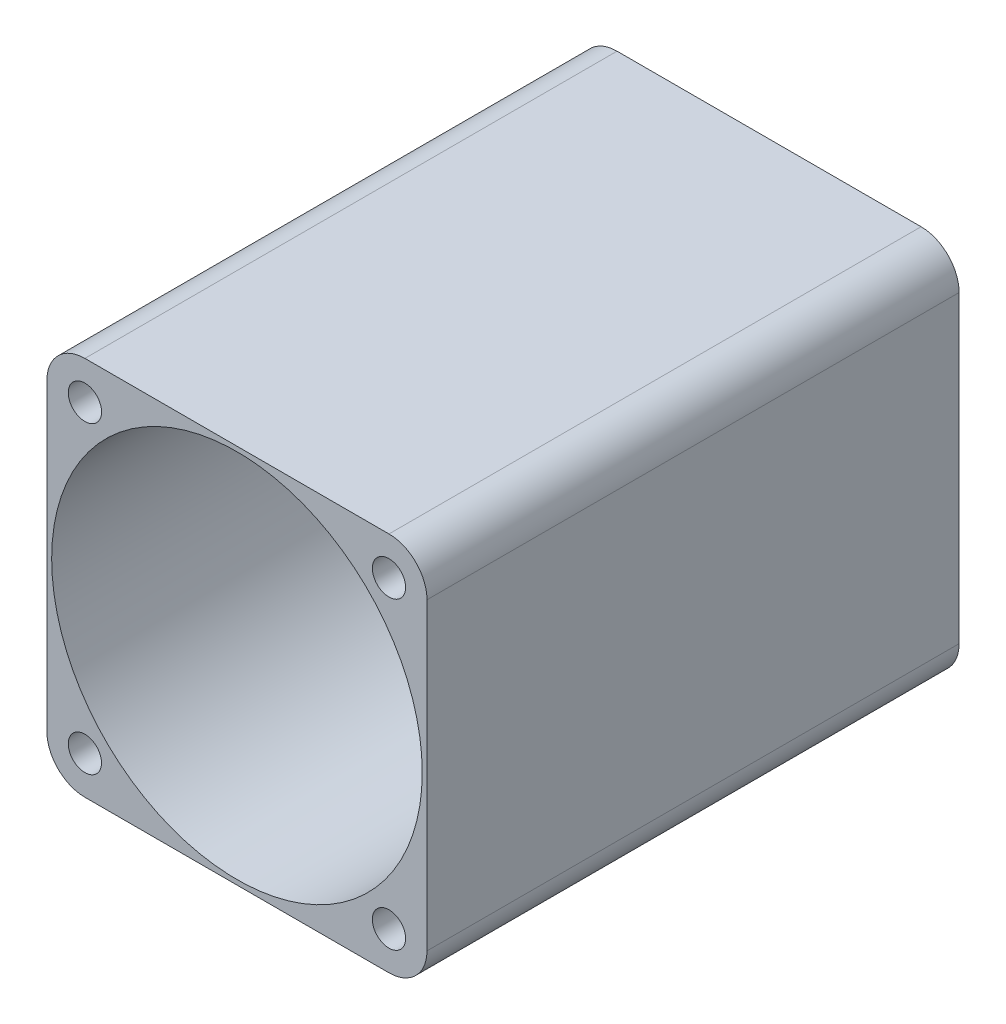
ISO-10303-21;
HEADER;
FILE_DESCRIPTION(('STEP AP214'),'2;1');
FILE_NAME('part.step','',(''),(''),'','','');
FILE_SCHEMA(('AUTOMOTIVE_DESIGN { 1 0 10303 214 1 1 1 1 }'));
ENDSEC;
DATA;
#1=APPLICATION_CONTEXT('core data for automotive mechanical design processes');
#2=APPLICATION_PROTOCOL_DEFINITION('international standard','automotive_design',2000,#1);
#3=PRODUCT_CONTEXT('',#1,'mechanical');
#4=PRODUCT('Part','Part','',(#3));
#5=PRODUCT_RELATED_PRODUCT_CATEGORY('part','',(#4));
#6=PRODUCT_DEFINITION_FORMATION('','',#4);
#7=PRODUCT_DEFINITION_CONTEXT('part definition',#1,'design');
#8=PRODUCT_DEFINITION('design','',#6,#7);
#9=PRODUCT_DEFINITION_SHAPE('','',#8);
#10=(LENGTH_UNIT() NAMED_UNIT(*) SI_UNIT(.MILLI.,.METRE.));
#11=(NAMED_UNIT(*) PLANE_ANGLE_UNIT() SI_UNIT($,.RADIAN.));
#12=(NAMED_UNIT(*) SI_UNIT($,.STERADIAN.) SOLID_ANGLE_UNIT());
#13=UNCERTAINTY_MEASURE_WITH_UNIT(LENGTH_MEASURE(1.E-05),#10,'distance_accuracy_value','');
#14=(GEOMETRIC_REPRESENTATION_CONTEXT(3) GLOBAL_UNCERTAINTY_ASSIGNED_CONTEXT((#13)) GLOBAL_UNIT_ASSIGNED_CONTEXT((#10,
#11,#12)) REPRESENTATION_CONTEXT('',''));
#15=CARTESIAN_POINT('',(0.,0.,0.));
#16=DIRECTION('',(0.,0.,1.));
#17=DIRECTION('',(1.,0.,0.));
#18=AXIS2_PLACEMENT_3D('',#15,#16,#17);
#19=CARTESIAN_POINT('',(-16.,-16.,-56.));
#20=DIRECTION('',(0.,0.,1.));
#21=DIRECTION('',(1.,0.,0.));
#22=AXIS2_PLACEMENT_3D('',#19,#20,#21);
#23=CYLINDRICAL_SURFACE('',#22,4.);
#24=CARTESIAN_POINT('',(-16.,-16.,0.));
#25=DIRECTION('',(0.,0.,1.));
#26=DIRECTION('',(-1.,0.,0.));
#27=AXIS2_PLACEMENT_3D('',#24,#25,#26);
#28=CIRCLE('',#27,4.);
#29=CARTESIAN_POINT('',(-20.,-16.,0.));
#30=VERTEX_POINT('',#29);
#31=CARTESIAN_POINT('',(-16.,-20.,0.));
#32=VERTEX_POINT('',#31);
#33=EDGE_CURVE('E138',#30,#32,#28,.T.);
#34=ORIENTED_EDGE('',*,*,#33,.F.);
#35=DIRECTION('',(0.,0.,1.));
#36=VECTOR('',#35,1.);
#37=CARTESIAN_POINT('',(-20.,-16.,-56.));
#38=LINE('',#37,#36);
#39=CARTESIAN_POINT('',(-20.,-16.,-56.));
#40=VERTEX_POINT('',#39);
#41=EDGE_CURVE('E11',#40,#30,#38,.T.);
#42=ORIENTED_EDGE('',*,*,#41,.F.);
#43=CARTESIAN_POINT('',(-16.,-16.,-56.));
#44=DIRECTION('',(0.,0.,1.));
#45=DIRECTION('',(-1.,0.,0.));
#46=AXIS2_PLACEMENT_3D('',#43,#44,#45);
#47=CIRCLE('',#46,4.);
#48=CARTESIAN_POINT('',(-16.,-20.,-56.));
#49=VERTEX_POINT('',#48);
#50=EDGE_CURVE('E159',#40,#49,#47,.T.);
#51=ORIENTED_EDGE('',*,*,#50,.T.);
#52=DIRECTION('',(0.,0.,1.));
#53=VECTOR('',#52,1.);
#54=CARTESIAN_POINT('',(-16.,-20.,-56.));
#55=LINE('',#54,#53);
#56=EDGE_CURVE('E44',#49,#32,#55,.T.);
#57=ORIENTED_EDGE('',*,*,#56,.T.);
#58=EDGE_LOOP('',(#34,#42,#51,#57));
#59=FACE_BOUND('',#58,.T.);
#60=ADVANCED_FACE('F41',(#59),#23,.T.);
#61=CARTESIAN_POINT('',(-20.,-16.,-56.));
#62=DIRECTION('',(-1.,0.,0.));
#63=DIRECTION('',(0.,0.,1.));
#64=AXIS2_PLACEMENT_3D('',#61,#62,#63);
#65=PLANE('',#64);
#66=DIRECTION('',(0.,-1.,0.));
#67=VECTOR('',#66,1.);
#68=CARTESIAN_POINT('',(-20.,-16.,0.));
#69=LINE('',#68,#67);
#70=CARTESIAN_POINT('',(-20.,16.,0.));
#71=VERTEX_POINT('',#70);
#72=EDGE_CURVE('E157',#71,#30,#69,.T.);
#73=ORIENTED_EDGE('',*,*,#72,.F.);
#74=DIRECTION('',(0.,0.,1.));
#75=VECTOR('',#74,1.);
#76=CARTESIAN_POINT('',(-20.,16.,-56.));
#77=LINE('',#76,#75);
#78=CARTESIAN_POINT('',(-20.,16.,-56.));
#79=VERTEX_POINT('',#78);
#80=EDGE_CURVE('E50',#79,#71,#77,.T.);
#81=ORIENTED_EDGE('',*,*,#80,.F.);
#82=DIRECTION('',(0.,-1.,0.));
#83=VECTOR('',#82,1.);
#84=CARTESIAN_POINT('',(-20.,-16.,-56.));
#85=LINE('',#84,#83);
#86=EDGE_CURVE('E128',#79,#40,#85,.T.);
#87=ORIENTED_EDGE('',*,*,#86,.T.);
#88=ORIENTED_EDGE('',*,*,#41,.T.);
#89=EDGE_LOOP('',(#73,#81,#87,#88));
#90=FACE_BOUND('',#89,.T.);
#91=ADVANCED_FACE('F171',(#90),#65,.T.);
#92=CARTESIAN_POINT('',(-16.,16.,-56.));
#93=DIRECTION('',(0.,0.,1.));
#94=DIRECTION('',(1.,0.,0.));
#95=AXIS2_PLACEMENT_3D('',#92,#93,#94);
#96=CYLINDRICAL_SURFACE('',#95,4.);
#97=CARTESIAN_POINT('',(-16.,16.,0.));
#98=DIRECTION('',(0.,0.,1.));
#99=DIRECTION('',(1.,0.,0.));
#100=AXIS2_PLACEMENT_3D('',#97,#98,#99);
#101=CIRCLE('',#100,4.);
#102=CARTESIAN_POINT('',(-16.,20.,0.));
#103=VERTEX_POINT('',#102);
#104=EDGE_CURVE('E115',#103,#71,#101,.T.);
#105=ORIENTED_EDGE('',*,*,#104,.F.);
#106=DIRECTION('',(0.,0.,1.));
#107=VECTOR('',#106,1.);
#108=CARTESIAN_POINT('',(-16.,20.,-56.));
#109=LINE('',#108,#107);
#110=CARTESIAN_POINT('',(-16.,20.,-56.));
#111=VERTEX_POINT('',#110);
#112=EDGE_CURVE('E110',#111,#103,#109,.T.);
#113=ORIENTED_EDGE('',*,*,#112,.F.);
#114=CARTESIAN_POINT('',(-16.,16.,-56.));
#115=DIRECTION('',(0.,0.,1.));
#116=DIRECTION('',(1.,0.,0.));
#117=AXIS2_PLACEMENT_3D('',#114,#115,#116);
#118=CIRCLE('',#117,4.);
#119=EDGE_CURVE('E113',#111,#79,#118,.T.);
#120=ORIENTED_EDGE('',*,*,#119,.T.);
#121=ORIENTED_EDGE('',*,*,#80,.T.);
#122=EDGE_LOOP('',(#105,#113,#120,#121));
#123=FACE_BOUND('',#122,.T.);
#124=ADVANCED_FACE('F112',(#123),#96,.T.);
#125=CARTESIAN_POINT('',(-16.,20.,-56.));
#126=DIRECTION('',(0.,1.,0.));
#127=DIRECTION('',(0.,0.,1.));
#128=AXIS2_PLACEMENT_3D('',#125,#126,#127);
#129=PLANE('',#128);
#130=DIRECTION('',(-1.,0.,0.));
#131=VECTOR('',#130,1.);
#132=CARTESIAN_POINT('',(-16.,20.,0.));
#133=LINE('',#132,#131);
#134=CARTESIAN_POINT('',(16.,20.,0.));
#135=VERTEX_POINT('',#134);
#136=EDGE_CURVE('E154',#135,#103,#133,.T.);
#137=ORIENTED_EDGE('',*,*,#136,.F.);
#138=DIRECTION('',(0.,0.,1.));
#139=VECTOR('',#138,1.);
#140=CARTESIAN_POINT('',(16.,20.,-56.));
#141=LINE('',#140,#139);
#142=CARTESIAN_POINT('',(16.,20.,-56.));
#143=VERTEX_POINT('',#142);
#144=EDGE_CURVE('E120',#143,#135,#141,.T.);
#145=ORIENTED_EDGE('',*,*,#144,.F.);
#146=DIRECTION('',(-1.,0.,0.));
#147=VECTOR('',#146,1.);
#148=CARTESIAN_POINT('',(-16.,20.,-56.));
#149=LINE('',#148,#147);
#150=EDGE_CURVE('E126',#143,#111,#149,.T.);
#151=ORIENTED_EDGE('',*,*,#150,.T.);
#152=ORIENTED_EDGE('',*,*,#112,.T.);
#153=EDGE_LOOP('',(#137,#145,#151,#152));
#154=FACE_BOUND('',#153,.T.);
#155=ADVANCED_FACE('F130',(#154),#129,.T.);
#156=CARTESIAN_POINT('',(16.,16.,-56.));
#157=DIRECTION('',(0.,0.,1.));
#158=DIRECTION('',(1.,0.,0.));
#159=AXIS2_PLACEMENT_3D('',#156,#157,#158);
#160=CYLINDRICAL_SURFACE('',#159,4.);
#161=CARTESIAN_POINT('',(16.,16.,0.));
#162=DIRECTION('',(0.,0.,1.));
#163=DIRECTION('',(-1.,0.,0.));
#164=AXIS2_PLACEMENT_3D('',#161,#162,#163);
#165=CIRCLE('',#164,4.);
#166=CARTESIAN_POINT('',(20.,16.,0.));
#167=VERTEX_POINT('',#166);
#168=EDGE_CURVE('E151',#167,#135,#165,.T.);
#169=ORIENTED_EDGE('',*,*,#168,.F.);
#170=DIRECTION('',(0.,0.,1.));
#171=VECTOR('',#170,1.);
#172=CARTESIAN_POINT('',(20.,16.,-56.));
#173=LINE('',#172,#171);
#174=CARTESIAN_POINT('',(20.,16.,-56.));
#175=VERTEX_POINT('',#174);
#176=EDGE_CURVE('E163',#175,#167,#173,.T.);
#177=ORIENTED_EDGE('',*,*,#176,.F.);
#178=CARTESIAN_POINT('',(16.,16.,-56.));
#179=DIRECTION('',(0.,0.,1.));
#180=DIRECTION('',(-1.,0.,0.));
#181=AXIS2_PLACEMENT_3D('',#178,#179,#180);
#182=CIRCLE('',#181,4.);
#183=EDGE_CURVE('E131',#175,#143,#182,.T.);
#184=ORIENTED_EDGE('',*,*,#183,.T.);
#185=ORIENTED_EDGE('',*,*,#144,.T.);
#186=EDGE_LOOP('',(#169,#177,#184,#185));
#187=FACE_BOUND('',#186,.T.);
#188=ADVANCED_FACE('F184',(#187),#160,.T.);
#189=CARTESIAN_POINT('',(20.,-16.,-56.));
#190=DIRECTION('',(1.,0.,0.));
#191=DIRECTION('',(0.,0.,-1.));
#192=AXIS2_PLACEMENT_3D('',#189,#190,#191);
#193=PLANE('',#192);
#194=DIRECTION('',(0.,1.,0.));
#195=VECTOR('',#194,1.);
#196=CARTESIAN_POINT('',(20.,-16.,0.));
#197=LINE('',#196,#195);
#198=CARTESIAN_POINT('',(20.,-16.,0.));
#199=VERTEX_POINT('',#198);
#200=EDGE_CURVE('E148',#199,#167,#197,.T.);
#201=ORIENTED_EDGE('',*,*,#200,.F.);
#202=DIRECTION('',(0.,0.,1.));
#203=VECTOR('',#202,1.);
#204=CARTESIAN_POINT('',(20.,-16.,-56.));
#205=LINE('',#204,#203);
#206=CARTESIAN_POINT('',(20.,-16.,-56.));
#207=VERTEX_POINT('',#206);
#208=EDGE_CURVE('E165',#207,#199,#205,.T.);
#209=ORIENTED_EDGE('',*,*,#208,.F.);
#210=DIRECTION('',(0.,1.,0.));
#211=VECTOR('',#210,1.);
#212=CARTESIAN_POINT('',(20.,-16.,-56.));
#213=LINE('',#212,#211);
#214=EDGE_CURVE('E133',#207,#175,#213,.T.);
#215=ORIENTED_EDGE('',*,*,#214,.T.);
#216=ORIENTED_EDGE('',*,*,#176,.T.);
#217=EDGE_LOOP('',(#201,#209,#215,#216));
#218=FACE_BOUND('',#217,.T.);
#219=ADVANCED_FACE('F187',(#218),#193,.T.);
#220=CARTESIAN_POINT('',(16.,-16.,-56.));
#221=DIRECTION('',(0.,0.,1.));
#222=DIRECTION('',(1.,0.,0.));
#223=AXIS2_PLACEMENT_3D('',#220,#221,#222);
#224=CYLINDRICAL_SURFACE('',#223,4.);
#225=CARTESIAN_POINT('',(16.,-16.,0.));
#226=DIRECTION('',(0.,0.,1.));
#227=DIRECTION('',(1.,0.,0.));
#228=AXIS2_PLACEMENT_3D('',#225,#226,#227);
#229=CIRCLE('',#228,4.);
#230=CARTESIAN_POINT('',(16.,-20.,0.));
#231=VERTEX_POINT('',#230);
#232=EDGE_CURVE('E145',#231,#199,#229,.T.);
#233=ORIENTED_EDGE('',*,*,#232,.F.);
#234=DIRECTION('',(0.,0.,1.));
#235=VECTOR('',#234,1.);
#236=CARTESIAN_POINT('',(16.,-20.,-56.));
#237=LINE('',#236,#235);
#238=CARTESIAN_POINT('',(16.,-20.,-56.));
#239=VERTEX_POINT('',#238);
#240=EDGE_CURVE('E166',#239,#231,#237,.T.);
#241=ORIENTED_EDGE('',*,*,#240,.F.);
#242=CARTESIAN_POINT('',(16.,-16.,-56.));
#243=DIRECTION('',(0.,0.,1.));
#244=DIRECTION('',(1.,0.,0.));
#245=AXIS2_PLACEMENT_3D('',#242,#243,#244);
#246=CIRCLE('',#245,4.);
#247=EDGE_CURVE('E263',#239,#207,#246,.T.);
#248=ORIENTED_EDGE('',*,*,#247,.T.);
#249=ORIENTED_EDGE('',*,*,#208,.T.);
#250=EDGE_LOOP('',(#233,#241,#248,#249));
#251=FACE_BOUND('',#250,.T.);
#252=ADVANCED_FACE('F191',(#251),#224,.T.);
#253=CARTESIAN_POINT('',(-16.,-20.,-56.));
#254=DIRECTION('',(0.,-1.,0.));
#255=DIRECTION('',(0.,0.,-1.));
#256=AXIS2_PLACEMENT_3D('',#253,#254,#255);
#257=PLANE('',#256);
#258=DIRECTION('',(1.,0.,0.));
#259=VECTOR('',#258,1.);
#260=CARTESIAN_POINT('',(-16.,-20.,0.));
#261=LINE('',#260,#259);
#262=EDGE_CURVE('E141',#32,#231,#261,.T.);
#263=ORIENTED_EDGE('',*,*,#262,.F.);
#264=ORIENTED_EDGE('',*,*,#56,.F.);
#265=DIRECTION('',(1.,0.,0.));
#266=VECTOR('',#265,1.);
#267=CARTESIAN_POINT('',(-16.,-20.,-56.));
#268=LINE('',#267,#266);
#269=EDGE_CURVE('E261',#49,#239,#268,.T.);
#270=ORIENTED_EDGE('',*,*,#269,.T.);
#271=ORIENTED_EDGE('',*,*,#240,.T.);
#272=EDGE_LOOP('',(#263,#264,#270,#271));
#273=FACE_BOUND('',#272,.T.);
#274=ADVANCED_FACE('F168',(#273),#257,.T.);
#275=CARTESIAN_POINT('',(-16.,-16.,-56.));
#276=DIRECTION('',(0.,0.,-1.));
#277=DIRECTION('',(-1.,0.,0.));
#278=AXIS2_PLACEMENT_3D('',#275,#276,#277);
#279=PLANE('',#278);
#280=CARTESIAN_POINT('',(0.,0.,-56.));
#281=DIRECTION('',(0.,0.,1.));
#282=DIRECTION('',(1.,0.,0.));
#283=AXIS2_PLACEMENT_3D('',#280,#281,#282);
#284=CIRCLE('',#283,19.5);
#285=CARTESIAN_POINT('',(19.5,0.,-56.));
#286=VERTEX_POINT('',#285);
#287=EDGE_CURVE('E230',#286,#286,#284,.T.);
#288=ORIENTED_EDGE('',*,*,#287,.T.);
#289=EDGE_LOOP('',(#288));
#290=FACE_BOUND('',#289,.T.);
#291=CARTESIAN_POINT('',(-16.,-16.,-56.));
#292=DIRECTION('',(0.,0.,1.));
#293=DIRECTION('',(1.,0.,0.));
#294=AXIS2_PLACEMENT_3D('',#291,#292,#293);
#295=CIRCLE('',#294,1.75);
#296=CARTESIAN_POINT('',(-14.25,-16.,-56.));
#297=VERTEX_POINT('',#296);
#298=EDGE_CURVE('E238',#297,#297,#295,.T.);
#299=ORIENTED_EDGE('',*,*,#298,.T.);
#300=EDGE_LOOP('',(#299));
#301=FACE_BOUND('',#300,.T.);
#302=CARTESIAN_POINT('',(-16.,16.,-56.));
#303=DIRECTION('',(0.,0.,1.));
#304=DIRECTION('',(-1.,0.,0.));
#305=AXIS2_PLACEMENT_3D('',#302,#303,#304);
#306=CIRCLE('',#305,1.75);
#307=CARTESIAN_POINT('',(-17.75,16.,-56.));
#308=VERTEX_POINT('',#307);
#309=EDGE_CURVE('E244',#308,#308,#306,.T.);
#310=ORIENTED_EDGE('',*,*,#309,.T.);
#311=EDGE_LOOP('',(#310));
#312=FACE_BOUND('',#311,.T.);
#313=CARTESIAN_POINT('',(16.,-16.,-56.));
#314=DIRECTION('',(0.,0.,1.));
#315=DIRECTION('',(-1.,0.,0.));
#316=AXIS2_PLACEMENT_3D('',#313,#314,#315);
#317=CIRCLE('',#316,1.75);
#318=CARTESIAN_POINT('',(14.25,-16.,-56.));
#319=VERTEX_POINT('',#318);
#320=EDGE_CURVE('E250',#319,#319,#317,.T.);
#321=ORIENTED_EDGE('',*,*,#320,.T.);
#322=EDGE_LOOP('',(#321));
#323=FACE_BOUND('',#322,.T.);
#324=CARTESIAN_POINT('',(16.,16.,-56.));
#325=DIRECTION('',(0.,0.,1.));
#326=DIRECTION('',(1.,0.,0.));
#327=AXIS2_PLACEMENT_3D('',#324,#325,#326);
#328=CIRCLE('',#327,1.75);
#329=CARTESIAN_POINT('',(17.75,16.,-56.));
#330=VERTEX_POINT('',#329);
#331=EDGE_CURVE('E142',#330,#330,#328,.T.);
#332=ORIENTED_EDGE('',*,*,#331,.T.);
#333=EDGE_LOOP('',(#332));
#334=FACE_BOUND('',#333,.T.);
#335=ORIENTED_EDGE('',*,*,#50,.F.);
#336=ORIENTED_EDGE('',*,*,#86,.F.);
#337=ORIENTED_EDGE('',*,*,#119,.F.);
#338=ORIENTED_EDGE('',*,*,#150,.F.);
#339=ORIENTED_EDGE('',*,*,#183,.F.);
#340=ORIENTED_EDGE('',*,*,#214,.F.);
#341=ORIENTED_EDGE('',*,*,#247,.F.);
#342=ORIENTED_EDGE('',*,*,#269,.F.);
#343=EDGE_LOOP('',(#335,#336,#337,#338,#339,#340,#341,#342));
#344=FACE_BOUND('',#343,.T.);
#345=ADVANCED_FACE('F124',(#290,#301,#312,#323,#334,#344),#279,.T.);
#346=CARTESIAN_POINT('',(-16.,-16.,0.));
#347=DIRECTION('',(0.,0.,-1.));
#348=DIRECTION('',(-1.,0.,0.));
#349=AXIS2_PLACEMENT_3D('',#346,#347,#348);
#350=PLANE('',#349);
#351=CARTESIAN_POINT('',(0.,0.,0.));
#352=DIRECTION('',(0.,0.,1.));
#353=DIRECTION('',(1.,0.,0.));
#354=AXIS2_PLACEMENT_3D('',#351,#352,#353);
#355=CIRCLE('',#354,19.5);
#356=CARTESIAN_POINT('',(19.5,0.,0.));
#357=VERTEX_POINT('',#356);
#358=EDGE_CURVE('E233',#357,#357,#355,.T.);
#359=ORIENTED_EDGE('',*,*,#358,.F.);
#360=EDGE_LOOP('',(#359));
#361=FACE_BOUND('',#360,.T.);
#362=CARTESIAN_POINT('',(-16.,-16.,0.));
#363=DIRECTION('',(0.,0.,1.));
#364=DIRECTION('',(1.,0.,0.));
#365=AXIS2_PLACEMENT_3D('',#362,#363,#364);
#366=CIRCLE('',#365,1.75);
#367=CARTESIAN_POINT('',(-14.25,-16.,0.));
#368=VERTEX_POINT('',#367);
#369=EDGE_CURVE('E235',#368,#368,#366,.T.);
#370=ORIENTED_EDGE('',*,*,#369,.F.);
#371=EDGE_LOOP('',(#370));
#372=FACE_BOUND('',#371,.T.);
#373=CARTESIAN_POINT('',(-16.,16.,0.));
#374=DIRECTION('',(0.,0.,1.));
#375=DIRECTION('',(-1.,0.,0.));
#376=AXIS2_PLACEMENT_3D('',#373,#374,#375);
#377=CIRCLE('',#376,1.75);
#378=CARTESIAN_POINT('',(-17.75,16.,0.));
#379=VERTEX_POINT('',#378);
#380=EDGE_CURVE('E241',#379,#379,#377,.T.);
#381=ORIENTED_EDGE('',*,*,#380,.F.);
#382=EDGE_LOOP('',(#381));
#383=FACE_BOUND('',#382,.T.);
#384=CARTESIAN_POINT('',(16.,-16.,0.));
#385=DIRECTION('',(0.,0.,1.));
#386=DIRECTION('',(-1.,0.,0.));
#387=AXIS2_PLACEMENT_3D('',#384,#385,#386);
#388=CIRCLE('',#387,1.75);
#389=CARTESIAN_POINT('',(14.25,-16.,0.));
#390=VERTEX_POINT('',#389);
#391=EDGE_CURVE('E247',#390,#390,#388,.T.);
#392=ORIENTED_EDGE('',*,*,#391,.F.);
#393=EDGE_LOOP('',(#392));
#394=FACE_BOUND('',#393,.T.);
#395=CARTESIAN_POINT('',(16.,16.,0.));
#396=DIRECTION('',(0.,0.,1.));
#397=DIRECTION('',(1.,0.,0.));
#398=AXIS2_PLACEMENT_3D('',#395,#396,#397);
#399=CIRCLE('',#398,1.75);
#400=CARTESIAN_POINT('',(17.75,16.,0.));
#401=VERTEX_POINT('',#400);
#402=EDGE_CURVE('E253',#401,#401,#399,.T.);
#403=ORIENTED_EDGE('',*,*,#402,.F.);
#404=EDGE_LOOP('',(#403));
#405=FACE_BOUND('',#404,.T.);
#406=ORIENTED_EDGE('',*,*,#33,.T.);
#407=ORIENTED_EDGE('',*,*,#262,.T.);
#408=ORIENTED_EDGE('',*,*,#232,.T.);
#409=ORIENTED_EDGE('',*,*,#200,.T.);
#410=ORIENTED_EDGE('',*,*,#168,.T.);
#411=ORIENTED_EDGE('',*,*,#136,.T.);
#412=ORIENTED_EDGE('',*,*,#104,.T.);
#413=ORIENTED_EDGE('',*,*,#72,.T.);
#414=EDGE_LOOP('',(#406,#407,#408,#409,#410,#411,#412,#413));
#415=FACE_BOUND('',#414,.T.);
#416=ADVANCED_FACE('F170',(#361,#372,#383,#394,#405,#415),#350,.F.);
#417=CARTESIAN_POINT('',(16.,16.,-56.));
#418=DIRECTION('',(0.,0.,1.));
#419=DIRECTION('',(1.,0.,0.));
#420=AXIS2_PLACEMENT_3D('',#417,#418,#419);
#421=CYLINDRICAL_SURFACE('',#420,1.75);
#422=ORIENTED_EDGE('',*,*,#331,.F.);
#423=EDGE_LOOP('',(#422));
#424=FACE_BOUND('',#423,.T.);
#425=ORIENTED_EDGE('',*,*,#402,.T.);
#426=EDGE_LOOP('',(#425));
#427=FACE_BOUND('',#426,.T.);
#428=ADVANCED_FACE('F203',(#424,#427),#421,.F.);
#429=CARTESIAN_POINT('',(16.,-16.,-56.));
#430=DIRECTION('',(0.,0.,1.));
#431=DIRECTION('',(1.,0.,0.));
#432=AXIS2_PLACEMENT_3D('',#429,#430,#431);
#433=CYLINDRICAL_SURFACE('',#432,1.75);
#434=ORIENTED_EDGE('',*,*,#320,.F.);
#435=EDGE_LOOP('',(#434));
#436=FACE_BOUND('',#435,.T.);
#437=ORIENTED_EDGE('',*,*,#391,.T.);
#438=EDGE_LOOP('',(#437));
#439=FACE_BOUND('',#438,.T.);
#440=ADVANCED_FACE('F210',(#436,#439),#433,.F.);
#441=CARTESIAN_POINT('',(-16.,16.,-56.));
#442=DIRECTION('',(0.,0.,1.));
#443=DIRECTION('',(1.,0.,0.));
#444=AXIS2_PLACEMENT_3D('',#441,#442,#443);
#445=CYLINDRICAL_SURFACE('',#444,1.75);
#446=ORIENTED_EDGE('',*,*,#309,.F.);
#447=EDGE_LOOP('',(#446));
#448=FACE_BOUND('',#447,.T.);
#449=ORIENTED_EDGE('',*,*,#380,.T.);
#450=EDGE_LOOP('',(#449));
#451=FACE_BOUND('',#450,.T.);
#452=ADVANCED_FACE('F214',(#448,#451),#445,.F.);
#453=CARTESIAN_POINT('',(-16.,-16.,-56.));
#454=DIRECTION('',(0.,0.,1.));
#455=DIRECTION('',(1.,0.,0.));
#456=AXIS2_PLACEMENT_3D('',#453,#454,#455);
#457=CYLINDRICAL_SURFACE('',#456,1.75);
#458=ORIENTED_EDGE('',*,*,#298,.F.);
#459=EDGE_LOOP('',(#458));
#460=FACE_BOUND('',#459,.T.);
#461=ORIENTED_EDGE('',*,*,#369,.T.);
#462=EDGE_LOOP('',(#461));
#463=FACE_BOUND('',#462,.T.);
#464=ADVANCED_FACE('F218',(#460,#463),#457,.F.);
#465=CARTESIAN_POINT('',(0.,0.,-56.));
#466=DIRECTION('',(0.,0.,1.));
#467=DIRECTION('',(1.,0.,0.));
#468=AXIS2_PLACEMENT_3D('',#465,#466,#467);
#469=CYLINDRICAL_SURFACE('',#468,19.5);
#470=ORIENTED_EDGE('',*,*,#287,.F.);
#471=EDGE_LOOP('',(#470));
#472=FACE_BOUND('',#471,.T.);
#473=ORIENTED_EDGE('',*,*,#358,.T.);
#474=EDGE_LOOP('',(#473));
#475=FACE_BOUND('',#474,.T.);
#476=ADVANCED_FACE('F222',(#472,#475),#469,.F.);
#477=CLOSED_SHELL('',(#60,#91,#124,#155,#188,#219,#252,#274,#345,#416,#428,#440,#452,#464,#476));
#478=MANIFOLD_SOLID_BREP('B2',#477);
#479=ADVANCED_BREP_SHAPE_REPRESENTATION('',(#18,#478),#14);
#480=SHAPE_DEFINITION_REPRESENTATION(#9,#479);
ENDSEC;
END-ISO-10303-21;
